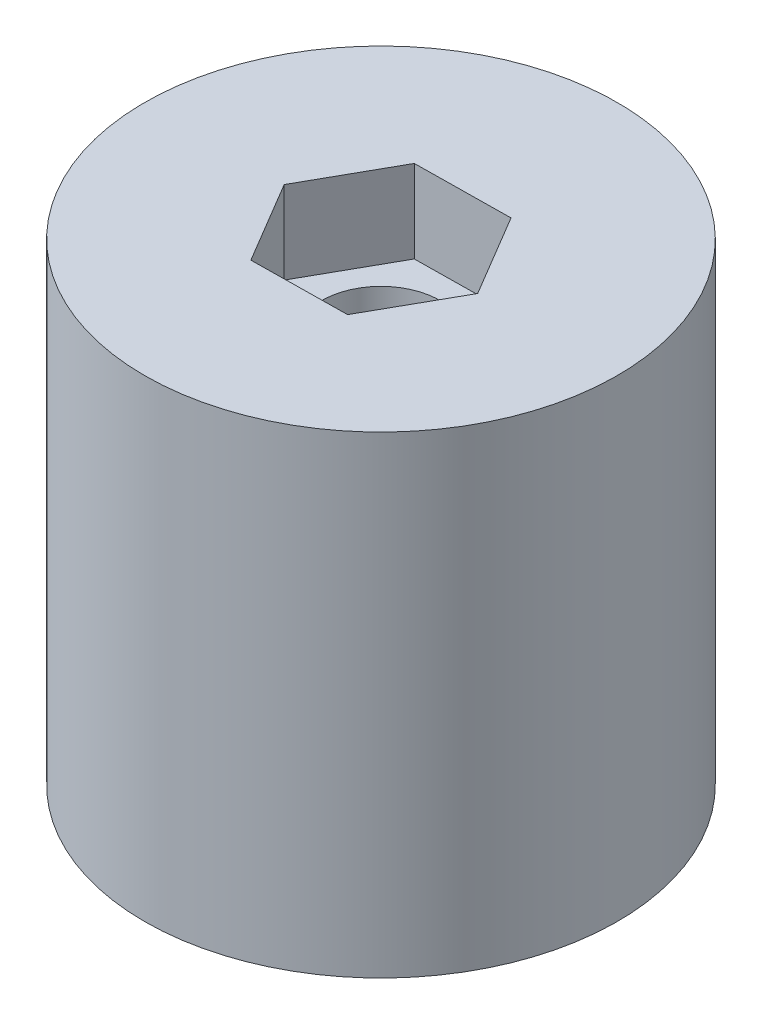
ISO-10303-21;
HEADER;
FILE_DESCRIPTION(('STEP AP214'),'2;1');
FILE_NAME('part.step','',(''),(''),'','','');
FILE_SCHEMA(('AUTOMOTIVE_DESIGN { 1 0 10303 214 1 1 1 1 }'));
ENDSEC;
DATA;
#1=APPLICATION_CONTEXT('core data for automotive mechanical design processes');
#2=APPLICATION_PROTOCOL_DEFINITION('international standard','automotive_design',2000,#1);
#3=PRODUCT_CONTEXT('',#1,'mechanical');
#4=PRODUCT('Part','Part','',(#3));
#5=PRODUCT_RELATED_PRODUCT_CATEGORY('part','',(#4));
#6=PRODUCT_DEFINITION_FORMATION('','',#4);
#7=PRODUCT_DEFINITION_CONTEXT('part definition',#1,'design');
#8=PRODUCT_DEFINITION('design','',#6,#7);
#9=PRODUCT_DEFINITION_SHAPE('','',#8);
#10=(LENGTH_UNIT() NAMED_UNIT(*) SI_UNIT(.MILLI.,.METRE.));
#11=(NAMED_UNIT(*) PLANE_ANGLE_UNIT() SI_UNIT($,.RADIAN.));
#12=(NAMED_UNIT(*) SI_UNIT($,.STERADIAN.) SOLID_ANGLE_UNIT());
#13=UNCERTAINTY_MEASURE_WITH_UNIT(LENGTH_MEASURE(1.E-05),#10,'distance_accuracy_value','');
#14=(GEOMETRIC_REPRESENTATION_CONTEXT(3) GLOBAL_UNCERTAINTY_ASSIGNED_CONTEXT((#13)) GLOBAL_UNIT_ASSIGNED_CONTEXT((#10,
#11,#12)) REPRESENTATION_CONTEXT('',''));
#15=CARTESIAN_POINT('',(0.,0.,0.));
#16=DIRECTION('',(0.,0.,1.));
#17=DIRECTION('',(1.,0.,0.));
#18=AXIS2_PLACEMENT_3D('',#15,#16,#17);
#19=CARTESIAN_POINT('',(0.,20.,0.));
#20=DIRECTION('',(0.,-1.,0.));
#21=DIRECTION('',(0.,0.,-1.));
#22=AXIS2_PLACEMENT_3D('',#19,#20,#21);
#23=CYLINDRICAL_SURFACE('',#22,2.5);
#24=CARTESIAN_POINT('',(0.,0.,0.));
#25=DIRECTION('',(0.,1.,0.));
#26=DIRECTION('',(0.,0.,1.));
#27=AXIS2_PLACEMENT_3D('',#24,#25,#26);
#28=CIRCLE('',#27,2.5);
#29=CARTESIAN_POINT('',(0.,0.,2.5));
#30=VERTEX_POINT('',#29);
#31=EDGE_CURVE('E169',#30,#30,#28,.T.);
#32=ORIENTED_EDGE('',*,*,#31,.F.);
#33=EDGE_LOOP('',(#32));
#34=FACE_BOUND('',#33,.T.);
#35=CARTESIAN_POINT('',(0.,16.5,0.));
#36=DIRECTION('',(0.,1.,0.));
#37=DIRECTION('',(0.,0.,1.));
#38=AXIS2_PLACEMENT_3D('',#35,#36,#37);
#39=CIRCLE('',#38,2.5);
#40=CARTESIAN_POINT('',(0.,16.5,2.5));
#41=VERTEX_POINT('',#40);
#42=EDGE_CURVE('E47',#41,#41,#39,.T.);
#43=ORIENTED_EDGE('',*,*,#42,.T.);
#44=EDGE_LOOP('',(#43));
#45=FACE_BOUND('',#44,.T.);
#46=ADVANCED_FACE('F43',(#34,#45),#23,.F.);
#47=CARTESIAN_POINT('',(0.,20.,0.));
#48=DIRECTION('',(0.,1.,0.));
#49=DIRECTION('',(0.,0.,1.));
#50=AXIS2_PLACEMENT_3D('',#47,#48,#49);
#51=PLANE('',#50);
#52=DIRECTION('',(0.999921845646448,0.,-0.0125021037829811));
#53=VECTOR('',#52,1.);
#54=CARTESIAN_POINT('',(-1.97681065039354,20.,3.52498978520846));
#55=LINE('',#54,#53);
#56=CARTESIAN_POINT('',(-1.97681065039354,20.,3.52498978520846));
#57=VERTEX_POINT('',#56);
#58=CARTESIAN_POINT('',(2.06432537687441,20.,3.47446313431668));
#59=VERTEX_POINT('',#58);
#60=EDGE_CURVE('E61',#57,#59,#55,.T.);
#61=ORIENTED_EDGE('',*,*,#60,.F.);
#62=DIRECTION('',(0.510788062300035,0.,0.859706668237356));
#63=VECTOR('',#62,1.);
#64=CARTESIAN_POINT('',(-4.04113602726795,20.,0.0505266508917851));
#65=LINE('',#64,#63);
#66=CARTESIAN_POINT('',(-4.04113602726795,20.,0.0505266508917851));
#67=VERTEX_POINT('',#66);
#68=EDGE_CURVE('E154',#67,#57,#65,.T.);
#69=ORIENTED_EDGE('',*,*,#68,.F.);
#70=DIRECTION('',(-0.489133783346413,0.,0.872208772020337));
#71=VECTOR('',#70,1.);
#72=CARTESIAN_POINT('',(-2.06432537687441,20.,-3.47446313431668));
#73=LINE('',#72,#71);
#74=CARTESIAN_POINT('',(-2.06432537687441,20.,-3.47446313431668));
#75=VERTEX_POINT('',#74);
#76=EDGE_CURVE('E151',#75,#67,#73,.T.);
#77=ORIENTED_EDGE('',*,*,#76,.F.);
#78=DIRECTION('',(-0.999921845646448,0.,0.0125021037829811));
#79=VECTOR('',#78,1.);
#80=CARTESIAN_POINT('',(1.97681065039354,20.,-3.52498978520846));
#81=LINE('',#80,#79);
#82=CARTESIAN_POINT('',(1.97681065039354,20.,-3.52498978520846));
#83=VERTEX_POINT('',#82);
#84=EDGE_CURVE('E109',#83,#75,#81,.T.);
#85=ORIENTED_EDGE('',*,*,#84,.F.);
#86=DIRECTION('',(-0.510788062300035,0.,-0.859706668237356));
#87=VECTOR('',#86,1.);
#88=CARTESIAN_POINT('',(4.04113602726795,20.,-0.0505266508917862));
#89=LINE('',#88,#87);
#90=CARTESIAN_POINT('',(4.04113602726795,20.,-0.0505266508917862));
#91=VERTEX_POINT('',#90);
#92=EDGE_CURVE('E145',#91,#83,#89,.T.);
#93=ORIENTED_EDGE('',*,*,#92,.F.);
#94=DIRECTION('',(0.489133783346413,0.,-0.872208772020337));
#95=VECTOR('',#94,1.);
#96=CARTESIAN_POINT('',(2.06432537687441,20.,3.47446313431668));
#97=LINE('',#96,#95);
#98=EDGE_CURVE('E141',#59,#91,#97,.T.);
#99=ORIENTED_EDGE('',*,*,#98,.F.);
#100=EDGE_LOOP('',(#61,#69,#77,#85,#93,#99));
#101=FACE_BOUND('',#100,.T.);
#102=CARTESIAN_POINT('',(0.,20.,0.));
#103=DIRECTION('',(0.,1.,0.));
#104=DIRECTION('',(0.,0.,1.));
#105=AXIS2_PLACEMENT_3D('',#102,#103,#104);
#106=CIRCLE('',#105,10.);
#107=CARTESIAN_POINT('',(0.,20.,10.));
#108=VERTEX_POINT('',#107);
#109=EDGE_CURVE('E11',#108,#108,#106,.T.);
#110=ORIENTED_EDGE('',*,*,#109,.T.);
#111=EDGE_LOOP('',(#110));
#112=FACE_BOUND('',#111,.T.);
#113=ADVANCED_FACE('F180',(#101,#112),#51,.T.);
#114=CARTESIAN_POINT('',(0.,0.,0.));
#115=DIRECTION('',(0.,1.,0.));
#116=DIRECTION('',(0.,0.,1.));
#117=AXIS2_PLACEMENT_3D('',#114,#115,#116);
#118=PLANE('',#117);
#119=CARTESIAN_POINT('',(0.,0.,0.));
#120=DIRECTION('',(0.,1.,0.));
#121=DIRECTION('',(0.,0.,1.));
#122=AXIS2_PLACEMENT_3D('',#119,#120,#121);
#123=CIRCLE('',#122,10.);
#124=CARTESIAN_POINT('',(0.,0.,10.));
#125=VERTEX_POINT('',#124);
#126=EDGE_CURVE('E53',#125,#125,#123,.T.);
#127=ORIENTED_EDGE('',*,*,#126,.F.);
#128=EDGE_LOOP('',(#127));
#129=FACE_BOUND('',#128,.T.);
#130=ORIENTED_EDGE('',*,*,#31,.T.);
#131=EDGE_LOOP('',(#130));
#132=FACE_BOUND('',#131,.T.);
#133=ADVANCED_FACE('F177',(#129,#132),#118,.F.);
#134=CARTESIAN_POINT('',(0.,20.,0.));
#135=DIRECTION('',(0.,-1.,0.));
#136=DIRECTION('',(0.,0.,-1.));
#137=AXIS2_PLACEMENT_3D('',#134,#135,#136);
#138=CYLINDRICAL_SURFACE('',#137,10.);
#139=ORIENTED_EDGE('',*,*,#109,.F.);
#140=EDGE_LOOP('',(#139));
#141=FACE_BOUND('',#140,.T.);
#142=ORIENTED_EDGE('',*,*,#126,.T.);
#143=EDGE_LOOP('',(#142));
#144=FACE_BOUND('',#143,.T.);
#145=ADVANCED_FACE('F45',(#141,#144),#138,.T.);
#146=CARTESIAN_POINT('',(-1.97681065039354,16.5,3.52498978520846));
#147=DIRECTION('',(0.0125021037829811,0.,0.999921845646448));
#148=DIRECTION('',(0.999921845646448,0.,-0.0125021037829811));
#149=AXIS2_PLACEMENT_3D('',#146,#147,#148);
#150=PLANE('',#149);
#151=ORIENTED_EDGE('',*,*,#60,.T.);
#152=DIRECTION('',(0.,1.,0.));
#153=VECTOR('',#152,1.);
#154=CARTESIAN_POINT('',(2.06432537687441,16.5,3.47446313431668));
#155=LINE('',#154,#153);
#156=CARTESIAN_POINT('',(2.06432537687441,16.5,3.47446313431668));
#157=VERTEX_POINT('',#156);
#158=EDGE_CURVE('E91',#157,#59,#155,.T.);
#159=ORIENTED_EDGE('',*,*,#158,.F.);
#160=DIRECTION('',(0.999921845646448,0.,-0.0125021037829811));
#161=VECTOR('',#160,1.);
#162=CARTESIAN_POINT('',(-1.97681065039354,16.5,3.52498978520846));
#163=LINE('',#162,#161);
#164=CARTESIAN_POINT('',(-1.97681065039354,16.5,3.52498978520846));
#165=VERTEX_POINT('',#164);
#166=EDGE_CURVE('E157',#165,#157,#163,.T.);
#167=ORIENTED_EDGE('',*,*,#166,.F.);
#168=DIRECTION('',(0.,1.,0.));
#169=VECTOR('',#168,1.);
#170=CARTESIAN_POINT('',(-1.97681065039354,16.5,3.52498978520846));
#171=LINE('',#170,#169);
#172=EDGE_CURVE('E69',#165,#57,#171,.T.);
#173=ORIENTED_EDGE('',*,*,#172,.T.);
#174=EDGE_LOOP('',(#151,#159,#167,#173));
#175=FACE_BOUND('',#174,.T.);
#176=ADVANCED_FACE('F203',(#175),#150,.F.);
#177=CARTESIAN_POINT('',(-4.04113602726795,16.5,0.0505266508917851));
#178=DIRECTION('',(-0.859706668237356,0.,0.510788062300035));
#179=DIRECTION('',(0.510788062300035,0.,0.859706668237356));
#180=AXIS2_PLACEMENT_3D('',#177,#178,#179);
#181=PLANE('',#180);
#182=ORIENTED_EDGE('',*,*,#68,.T.);
#183=ORIENTED_EDGE('',*,*,#172,.F.);
#184=DIRECTION('',(0.510788062300035,0.,0.859706668237356));
#185=VECTOR('',#184,1.);
#186=CARTESIAN_POINT('',(-4.04113602726795,16.5,0.0505266508917851));
#187=LINE('',#186,#185);
#188=CARTESIAN_POINT('',(-4.04113602726795,16.5,0.0505266508917851));
#189=VERTEX_POINT('',#188);
#190=EDGE_CURVE('E123',#189,#165,#187,.T.);
#191=ORIENTED_EDGE('',*,*,#190,.F.);
#192=DIRECTION('',(0.,1.,0.));
#193=VECTOR('',#192,1.);
#194=CARTESIAN_POINT('',(-4.04113602726795,16.5,0.0505266508917851));
#195=LINE('',#194,#193);
#196=EDGE_CURVE('E114',#189,#67,#195,.T.);
#197=ORIENTED_EDGE('',*,*,#196,.T.);
#198=EDGE_LOOP('',(#182,#183,#191,#197));
#199=FACE_BOUND('',#198,.T.);
#200=ADVANCED_FACE('F200',(#199),#181,.F.);
#201=CARTESIAN_POINT('',(-2.06432537687441,16.5,-3.47446313431668));
#202=DIRECTION('',(-0.872208772020337,0.,-0.489133783346413));
#203=DIRECTION('',(-0.489133783346413,0.,0.872208772020337));
#204=AXIS2_PLACEMENT_3D('',#201,#202,#203);
#205=PLANE('',#204);
#206=ORIENTED_EDGE('',*,*,#76,.T.);
#207=ORIENTED_EDGE('',*,*,#196,.F.);
#208=DIRECTION('',(-0.489133783346413,0.,0.872208772020337));
#209=VECTOR('',#208,1.);
#210=CARTESIAN_POINT('',(-2.06432537687441,16.5,-3.47446313431668));
#211=LINE('',#210,#209);
#212=CARTESIAN_POINT('',(-2.06432537687441,16.5,-3.47446313431668));
#213=VERTEX_POINT('',#212);
#214=EDGE_CURVE('E118',#213,#189,#211,.T.);
#215=ORIENTED_EDGE('',*,*,#214,.F.);
#216=DIRECTION('',(0.,1.,0.));
#217=VECTOR('',#216,1.);
#218=CARTESIAN_POINT('',(-2.06432537687441,16.5,-3.47446313431668));
#219=LINE('',#218,#217);
#220=EDGE_CURVE('E102',#213,#75,#219,.T.);
#221=ORIENTED_EDGE('',*,*,#220,.T.);
#222=EDGE_LOOP('',(#206,#207,#215,#221));
#223=FACE_BOUND('',#222,.T.);
#224=ADVANCED_FACE('F119',(#223),#205,.F.);
#225=CARTESIAN_POINT('',(1.97681065039354,16.5,-3.52498978520846));
#226=DIRECTION('',(-0.0125021037829811,0.,-0.999921845646448));
#227=DIRECTION('',(-0.999921845646448,0.,0.0125021037829811));
#228=AXIS2_PLACEMENT_3D('',#225,#226,#227);
#229=PLANE('',#228);
#230=ORIENTED_EDGE('',*,*,#84,.T.);
#231=ORIENTED_EDGE('',*,*,#220,.F.);
#232=DIRECTION('',(-0.999921845646448,0.,0.0125021037829811));
#233=VECTOR('',#232,1.);
#234=CARTESIAN_POINT('',(1.97681065039354,16.5,-3.52498978520846));
#235=LINE('',#234,#233);
#236=CARTESIAN_POINT('',(1.97681065039354,16.5,-3.52498978520846));
#237=VERTEX_POINT('',#236);
#238=EDGE_CURVE('E106',#237,#213,#235,.T.);
#239=ORIENTED_EDGE('',*,*,#238,.F.);
#240=DIRECTION('',(0.,1.,0.));
#241=VECTOR('',#240,1.);
#242=CARTESIAN_POINT('',(1.97681065039354,16.5,-3.52498978520846));
#243=LINE('',#242,#241);
#244=EDGE_CURVE('E115',#237,#83,#243,.T.);
#245=ORIENTED_EDGE('',*,*,#244,.T.);
#246=EDGE_LOOP('',(#230,#231,#239,#245));
#247=FACE_BOUND('',#246,.T.);
#248=ADVANCED_FACE('F104',(#247),#229,.F.);
#249=CARTESIAN_POINT('',(4.04113602726795,16.5,-0.0505266508917862));
#250=DIRECTION('',(0.859706668237356,0.,-0.510788062300035));
#251=DIRECTION('',(-0.510788062300035,0.,-0.859706668237356));
#252=AXIS2_PLACEMENT_3D('',#249,#250,#251);
#253=PLANE('',#252);
#254=ORIENTED_EDGE('',*,*,#92,.T.);
#255=ORIENTED_EDGE('',*,*,#244,.F.);
#256=DIRECTION('',(-0.510788062300035,0.,-0.859706668237356));
#257=VECTOR('',#256,1.);
#258=CARTESIAN_POINT('',(4.04113602726795,16.5,-0.0505266508917862));
#259=LINE('',#258,#257);
#260=CARTESIAN_POINT('',(4.04113602726795,16.5,-0.0505266508917862));
#261=VERTEX_POINT('',#260);
#262=EDGE_CURVE('E129',#261,#237,#259,.T.);
#263=ORIENTED_EDGE('',*,*,#262,.F.);
#264=DIRECTION('',(0.,1.,0.));
#265=VECTOR('',#264,1.);
#266=CARTESIAN_POINT('',(4.04113602726795,16.5,-0.0505266508917862));
#267=LINE('',#266,#265);
#268=EDGE_CURVE('E164',#261,#91,#267,.T.);
#269=ORIENTED_EDGE('',*,*,#268,.T.);
#270=EDGE_LOOP('',(#254,#255,#263,#269));
#271=FACE_BOUND('',#270,.T.);
#272=ADVANCED_FACE('F196',(#271),#253,.F.);
#273=CARTESIAN_POINT('',(2.06432537687441,16.5,3.47446313431668));
#274=DIRECTION('',(0.872208772020337,0.,0.489133783346413));
#275=DIRECTION('',(0.489133783346413,0.,-0.872208772020337));
#276=AXIS2_PLACEMENT_3D('',#273,#274,#275);
#277=PLANE('',#276);
#278=ORIENTED_EDGE('',*,*,#98,.T.);
#279=ORIENTED_EDGE('',*,*,#268,.F.);
#280=DIRECTION('',(0.489133783346413,0.,-0.872208772020337));
#281=VECTOR('',#280,1.);
#282=CARTESIAN_POINT('',(2.06432537687441,16.5,3.47446313431668));
#283=LINE('',#282,#281);
#284=EDGE_CURVE('E133',#157,#261,#283,.T.);
#285=ORIENTED_EDGE('',*,*,#284,.F.);
#286=ORIENTED_EDGE('',*,*,#158,.T.);
#287=EDGE_LOOP('',(#278,#279,#285,#286));
#288=FACE_BOUND('',#287,.T.);
#289=ADVANCED_FACE('F191',(#288),#277,.F.);
#290=CARTESIAN_POINT('',(0.,16.5,0.));
#291=DIRECTION('',(0.,1.,0.));
#292=DIRECTION('',(0.,0.,1.));
#293=AXIS2_PLACEMENT_3D('',#290,#291,#292);
#294=PLANE('',#293);
#295=ORIENTED_EDGE('',*,*,#42,.F.);
#296=EDGE_LOOP('',(#295));
#297=FACE_BOUND('',#296,.T.);
#298=ORIENTED_EDGE('',*,*,#166,.T.);
#299=ORIENTED_EDGE('',*,*,#284,.T.);
#300=ORIENTED_EDGE('',*,*,#262,.T.);
#301=ORIENTED_EDGE('',*,*,#238,.T.);
#302=ORIENTED_EDGE('',*,*,#214,.T.);
#303=ORIENTED_EDGE('',*,*,#190,.T.);
#304=EDGE_LOOP('',(#298,#299,#300,#301,#302,#303));
#305=FACE_BOUND('',#304,.T.);
#306=ADVANCED_FACE('F126',(#297,#305),#294,.T.);
#307=CLOSED_SHELL('',(#46,#113,#133,#145,#176,#200,#224,#248,#272,#289,#306));
#308=MANIFOLD_SOLID_BREP('B2',#307);
#309=ADVANCED_BREP_SHAPE_REPRESENTATION('',(#18,#308),#14);
#310=SHAPE_DEFINITION_REPRESENTATION(#9,#309);
ENDSEC;
END-ISO-10303-21;
